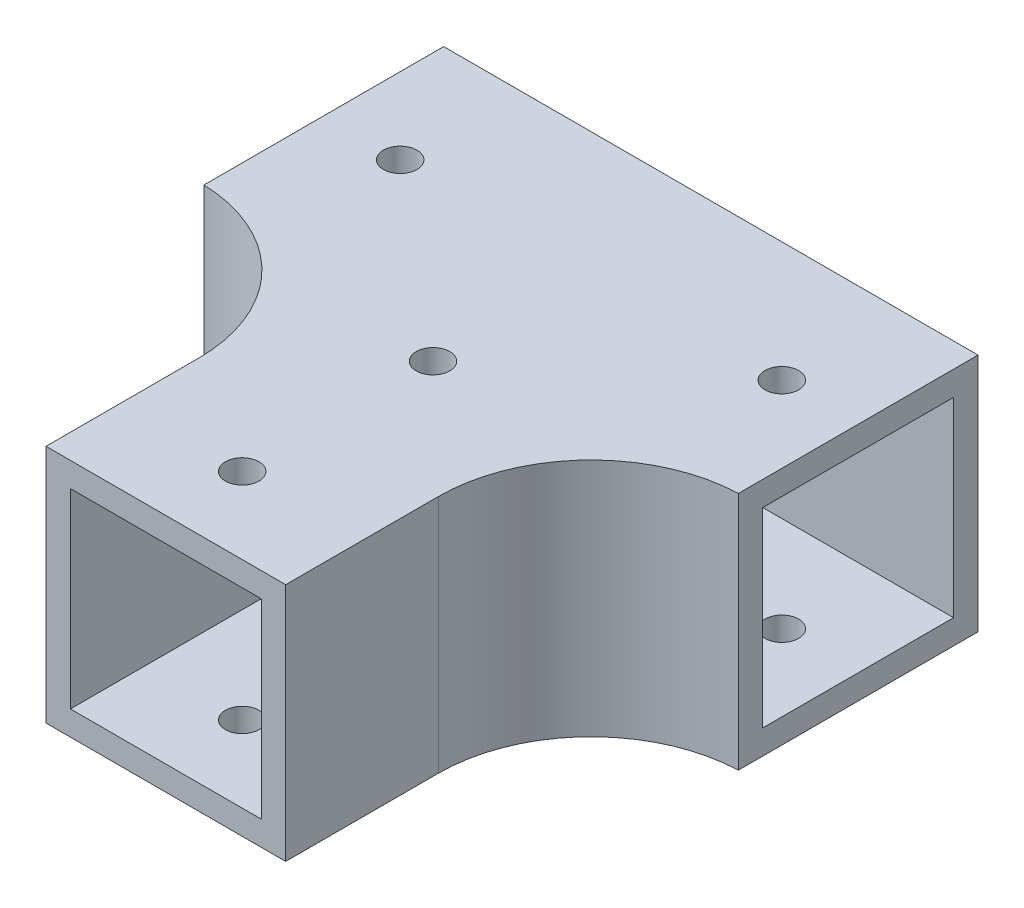
ISO-10303-21;
HEADER;
FILE_DESCRIPTION(('STEP AP214'),'2;1');
FILE_NAME('part.step','',(''),(''),'','','');
FILE_SCHEMA(('AUTOMOTIVE_DESIGN { 1 0 10303 214 1 1 1 1 }'));
ENDSEC;
DATA;
#1=APPLICATION_CONTEXT('core data for automotive mechanical design processes');
#2=APPLICATION_PROTOCOL_DEFINITION('international standard','automotive_design',2000,#1);
#3=PRODUCT_CONTEXT('',#1,'mechanical');
#4=PRODUCT('Part','Part','',(#3));
#5=PRODUCT_RELATED_PRODUCT_CATEGORY('part','',(#4));
#6=PRODUCT_DEFINITION_FORMATION('','',#4);
#7=PRODUCT_DEFINITION_CONTEXT('part definition',#1,'design');
#8=PRODUCT_DEFINITION('design','',#6,#7);
#9=PRODUCT_DEFINITION_SHAPE('','',#8);
#10=(LENGTH_UNIT() NAMED_UNIT(*) SI_UNIT(.MILLI.,.METRE.));
#11=(NAMED_UNIT(*) PLANE_ANGLE_UNIT() SI_UNIT($,.RADIAN.));
#12=(NAMED_UNIT(*) SI_UNIT($,.STERADIAN.) SOLID_ANGLE_UNIT());
#13=UNCERTAINTY_MEASURE_WITH_UNIT(LENGTH_MEASURE(1.E-05),#10,'distance_accuracy_value','');
#14=(GEOMETRIC_REPRESENTATION_CONTEXT(3) GLOBAL_UNCERTAINTY_ASSIGNED_CONTEXT((#13)) GLOBAL_UNIT_ASSIGNED_CONTEXT((#10,
#11,#12)) REPRESENTATION_CONTEXT('',''));
#15=CARTESIAN_POINT('',(0.,0.,0.));
#16=DIRECTION('',(0.,0.,1.));
#17=DIRECTION('',(1.,0.,0.));
#18=AXIS2_PLACEMENT_3D('',#15,#16,#17);
#19=CARTESIAN_POINT('',(70.,-12.5,12.5));
#20=DIRECTION('',(0.,0.,-1.));
#21=DIRECTION('',(-1.,0.,0.));
#22=AXIS2_PLACEMENT_3D('',#19,#20,#21);
#23=PLANE('',#22);
#24=DIRECTION('',(0.,1.,0.));
#25=VECTOR('',#24,1.);
#26=CARTESIAN_POINT('',(47.5,12.5,12.5));
#27=LINE('',#26,#25);
#28=CARTESIAN_POINT('',(47.5,-12.5,12.5));
#29=VERTEX_POINT('',#28);
#30=CARTESIAN_POINT('',(47.5,12.5,12.5));
#31=VERTEX_POINT('',#30);
#32=EDGE_CURVE('E198',#29,#31,#27,.T.);
#33=ORIENTED_EDGE('',*,*,#32,.T.);
#34=DIRECTION('',(-1.,0.,0.));
#35=VECTOR('',#34,1.);
#36=CARTESIAN_POINT('',(70.,12.5,12.5));
#37=LINE('',#36,#35);
#38=CARTESIAN_POINT('',(70.,12.5,12.5));
#39=VERTEX_POINT('',#38);
#40=EDGE_CURVE('E211',#39,#31,#37,.T.);
#41=ORIENTED_EDGE('',*,*,#40,.F.);
#42=DIRECTION('',(0.,-1.,0.));
#43=VECTOR('',#42,1.);
#44=CARTESIAN_POINT('',(70.,-12.5,12.5));
#45=LINE('',#44,#43);
#46=CARTESIAN_POINT('',(70.,-12.5,12.5));
#47=VERTEX_POINT('',#46);
#48=EDGE_CURVE('E327',#39,#47,#45,.T.);
#49=ORIENTED_EDGE('',*,*,#48,.T.);
#50=DIRECTION('',(-1.,0.,0.));
#51=VECTOR('',#50,1.);
#52=CARTESIAN_POINT('',(70.,-12.5,12.5));
#53=LINE('',#52,#51);
#54=EDGE_CURVE('E213',#47,#29,#53,.T.);
#55=ORIENTED_EDGE('',*,*,#54,.T.);
#56=EDGE_LOOP('',(#33,#41,#49,#55));
#57=FACE_BOUND('',#56,.T.);
#58=ADVANCED_FACE('F80',(#57),#23,.T.);
#59=CARTESIAN_POINT('',(70.,0.,0.));
#60=DIRECTION('',(1.,0.,0.));
#61=DIRECTION('',(0.,0.,-1.));
#62=AXIS2_PLACEMENT_3D('',#59,#60,#61);
#63=PLANE('',#62);
#64=DIRECTION('',(0.,1.,0.));
#65=VECTOR('',#64,1.);
#66=CARTESIAN_POINT('',(70.,0.,-15.7));
#67=LINE('',#66,#65);
#68=CARTESIAN_POINT('',(70.,-15.7,-15.7));
#69=VERTEX_POINT('',#68);
#70=CARTESIAN_POINT('',(70.,15.7,-15.7));
#71=VERTEX_POINT('',#70);
#72=EDGE_CURVE('E230',#69,#71,#67,.T.);
#73=ORIENTED_EDGE('',*,*,#72,.T.);
#74=DIRECTION('',(0.,0.,1.));
#75=VECTOR('',#74,1.);
#76=CARTESIAN_POINT('',(70.,15.7,0.));
#77=LINE('',#76,#75);
#78=CARTESIAN_POINT('',(70.,15.7,15.7));
#79=VERTEX_POINT('',#78);
#80=EDGE_CURVE('E233',#71,#79,#77,.T.);
#81=ORIENTED_EDGE('',*,*,#80,.T.);
#82=DIRECTION('',(0.,-1.,0.));
#83=VECTOR('',#82,1.);
#84=CARTESIAN_POINT('',(70.,0.,15.7));
#85=LINE('',#84,#83);
#86=CARTESIAN_POINT('',(70.,-15.7,15.7));
#87=VERTEX_POINT('',#86);
#88=EDGE_CURVE('E237',#79,#87,#85,.T.);
#89=ORIENTED_EDGE('',*,*,#88,.T.);
#90=DIRECTION('',(0.,0.,-1.));
#91=VECTOR('',#90,1.);
#92=CARTESIAN_POINT('',(70.,-15.7,0.));
#93=LINE('',#92,#91);
#94=EDGE_CURVE('E239',#87,#69,#93,.T.);
#95=ORIENTED_EDGE('',*,*,#94,.T.);
#96=EDGE_LOOP('',(#73,#81,#89,#95));
#97=FACE_BOUND('',#96,.T.);
#98=DIRECTION('',(0.,0.,1.));
#99=VECTOR('',#98,1.);
#100=CARTESIAN_POINT('',(70.,12.5,12.5));
#101=LINE('',#100,#99);
#102=CARTESIAN_POINT('',(70.,12.5,-12.5));
#103=VERTEX_POINT('',#102);
#104=EDGE_CURVE('E220',#103,#39,#101,.T.);
#105=ORIENTED_EDGE('',*,*,#104,.F.);
#106=DIRECTION('',(0.,1.,0.));
#107=VECTOR('',#106,1.);
#108=CARTESIAN_POINT('',(70.,-12.5,-12.5));
#109=LINE('',#108,#107);
#110=CARTESIAN_POINT('',(70.,-12.5,-12.5));
#111=VERTEX_POINT('',#110);
#112=EDGE_CURVE('E323',#111,#103,#109,.T.);
#113=ORIENTED_EDGE('',*,*,#112,.F.);
#114=DIRECTION('',(0.,0.,-1.));
#115=VECTOR('',#114,1.);
#116=CARTESIAN_POINT('',(70.,-12.5,12.5));
#117=LINE('',#116,#115);
#118=EDGE_CURVE('E329',#47,#111,#117,.T.);
#119=ORIENTED_EDGE('',*,*,#118,.F.);
#120=ORIENTED_EDGE('',*,*,#48,.F.);
#121=EDGE_LOOP('',(#105,#113,#119,#120));
#122=FACE_BOUND('',#121,.T.);
#123=ADVANCED_FACE('F360',(#97,#122),#63,.T.);
#124=CARTESIAN_POINT('',(0.,0.,0.));
#125=DIRECTION('',(1.,0.,0.));
#126=DIRECTION('',(0.,0.,-1.));
#127=AXIS2_PLACEMENT_3D('',#124,#125,#126);
#128=PLANE('',#127);
#129=DIRECTION('',(0.,1.,0.));
#130=VECTOR('',#129,1.);
#131=CARTESIAN_POINT('',(0.,0.,-15.7));
#132=LINE('',#131,#130);
#133=CARTESIAN_POINT('',(0.,-15.7,-15.7));
#134=VERTEX_POINT('',#133);
#135=CARTESIAN_POINT('',(0.,15.7,-15.7));
#136=VERTEX_POINT('',#135);
#137=EDGE_CURVE('E225',#134,#136,#132,.T.);
#138=ORIENTED_EDGE('',*,*,#137,.F.);
#139=DIRECTION('',(0.,0.,-1.));
#140=VECTOR('',#139,1.);
#141=CARTESIAN_POINT('',(0.,-15.7,0.));
#142=LINE('',#141,#140);
#143=CARTESIAN_POINT('',(0.,-15.7,15.7));
#144=VERTEX_POINT('',#143);
#145=EDGE_CURVE('E234',#144,#134,#142,.T.);
#146=ORIENTED_EDGE('',*,*,#145,.F.);
#147=DIRECTION('',(0.,-1.,0.));
#148=VECTOR('',#147,1.);
#149=CARTESIAN_POINT('',(0.,0.,15.7));
#150=LINE('',#149,#148);
#151=CARTESIAN_POINT('',(0.,15.7,15.7));
#152=VERTEX_POINT('',#151);
#153=EDGE_CURVE('E246',#152,#144,#150,.T.);
#154=ORIENTED_EDGE('',*,*,#153,.F.);
#155=DIRECTION('',(0.,0.,1.));
#156=VECTOR('',#155,1.);
#157=CARTESIAN_POINT('',(0.,15.7,0.));
#158=LINE('',#157,#156);
#159=EDGE_CURVE('E244',#136,#152,#158,.T.);
#160=ORIENTED_EDGE('',*,*,#159,.F.);
#161=EDGE_LOOP('',(#138,#146,#154,#160));
#162=FACE_BOUND('',#161,.T.);
#163=DIRECTION('',(0.,1.,0.));
#164=VECTOR('',#163,1.);
#165=CARTESIAN_POINT('',(0.,-12.5,-12.5));
#166=LINE('',#165,#164);
#167=CARTESIAN_POINT('',(0.,-12.5,-12.5));
#168=VERTEX_POINT('',#167);
#169=CARTESIAN_POINT('',(0.,12.5,-12.5));
#170=VERTEX_POINT('',#169);
#171=EDGE_CURVE('E322',#168,#170,#166,.T.);
#172=ORIENTED_EDGE('',*,*,#171,.T.);
#173=DIRECTION('',(0.,0.,1.));
#174=VECTOR('',#173,1.);
#175=CARTESIAN_POINT('',(0.,12.5,12.5));
#176=LINE('',#175,#174);
#177=CARTESIAN_POINT('',(0.,12.5,12.5));
#178=VERTEX_POINT('',#177);
#179=EDGE_CURVE('E334',#170,#178,#176,.T.);
#180=ORIENTED_EDGE('',*,*,#179,.T.);
#181=DIRECTION('',(0.,-1.,0.));
#182=VECTOR('',#181,1.);
#183=CARTESIAN_POINT('',(0.,-12.5,12.5));
#184=LINE('',#183,#182);
#185=CARTESIAN_POINT('',(0.,-12.5,12.5));
#186=VERTEX_POINT('',#185);
#187=EDGE_CURVE('E337',#178,#186,#184,.T.);
#188=ORIENTED_EDGE('',*,*,#187,.T.);
#189=DIRECTION('',(0.,0.,-1.));
#190=VECTOR('',#189,1.);
#191=CARTESIAN_POINT('',(0.,-12.5,12.5));
#192=LINE('',#191,#190);
#193=EDGE_CURVE('E325',#186,#168,#192,.T.);
#194=ORIENTED_EDGE('',*,*,#193,.T.);
#195=EDGE_LOOP('',(#172,#180,#188,#194));
#196=FACE_BOUND('',#195,.T.);
#197=ADVANCED_FACE('F354',(#162,#196),#128,.F.);
#198=CARTESIAN_POINT('',(70.,0.,-15.7));
#199=DIRECTION('',(0.,0.,1.));
#200=DIRECTION('',(1.,0.,0.));
#201=AXIS2_PLACEMENT_3D('',#198,#199,#200);
#202=PLANE('',#201);
#203=ORIENTED_EDGE('',*,*,#137,.T.);
#204=DIRECTION('',(-1.,0.,0.));
#205=VECTOR('',#204,1.);
#206=CARTESIAN_POINT('',(70.,15.7,-15.7));
#207=LINE('',#206,#205);
#208=EDGE_CURVE('E251',#71,#136,#207,.T.);
#209=ORIENTED_EDGE('',*,*,#208,.F.);
#210=ORIENTED_EDGE('',*,*,#72,.F.);
#211=DIRECTION('',(-1.,0.,0.));
#212=VECTOR('',#211,1.);
#213=CARTESIAN_POINT('',(70.,-15.7,-15.7));
#214=LINE('',#213,#212);
#215=EDGE_CURVE('E241',#69,#134,#214,.T.);
#216=ORIENTED_EDGE('',*,*,#215,.T.);
#217=EDGE_LOOP('',(#203,#209,#210,#216));
#218=FACE_BOUND('',#217,.T.);
#219=ADVANCED_FACE('F405',(#218),#202,.F.);
#220=CARTESIAN_POINT('',(70.,15.7,0.));
#221=DIRECTION('',(0.,-1.,0.));
#222=DIRECTION('',(0.,0.,-1.));
#223=AXIS2_PLACEMENT_3D('',#220,#221,#222);
#224=PLANE('',#223);
#225=CARTESIAN_POINT('',(10.,15.7,0.));
#226=DIRECTION('',(0.,1.,0.));
#227=DIRECTION('',(0.,0.,1.));
#228=AXIS2_PLACEMENT_3D('',#225,#226,#227);
#229=CIRCLE('',#228,2.2);
#230=CARTESIAN_POINT('',(10.,15.7,2.2));
#231=VERTEX_POINT('',#230);
#232=EDGE_CURVE('E472',#231,#231,#229,.T.);
#233=ORIENTED_EDGE('',*,*,#232,.F.);
#234=EDGE_LOOP('',(#233));
#235=FACE_BOUND('',#234,.T.);
#236=CARTESIAN_POINT('',(35.,15.7,20.7));
#237=DIRECTION('',(0.,1.,0.));
#238=DIRECTION('',(0.,0.,1.));
#239=AXIS2_PLACEMENT_3D('',#236,#237,#238);
#240=CIRCLE('',#239,2.2);
#241=CARTESIAN_POINT('',(35.,15.7,22.9));
#242=VERTEX_POINT('',#241);
#243=EDGE_CURVE('E483',#242,#242,#240,.T.);
#244=ORIENTED_EDGE('',*,*,#243,.F.);
#245=EDGE_LOOP('',(#244));
#246=FACE_BOUND('',#245,.T.);
#247=CARTESIAN_POINT('',(35.,15.7,45.7));
#248=DIRECTION('',(0.,1.,0.));
#249=DIRECTION('',(0.,0.,1.));
#250=AXIS2_PLACEMENT_3D('',#247,#248,#249);
#251=CIRCLE('',#250,2.2);
#252=CARTESIAN_POINT('',(35.,15.7,47.9));
#253=VERTEX_POINT('',#252);
#254=EDGE_CURVE('E475',#253,#253,#251,.T.);
#255=ORIENTED_EDGE('',*,*,#254,.F.);
#256=EDGE_LOOP('',(#255));
#257=FACE_BOUND('',#256,.T.);
#258=CARTESIAN_POINT('',(60.,15.7,0.));
#259=DIRECTION('',(0.,1.,0.));
#260=DIRECTION('',(0.,0.,1.));
#261=AXIS2_PLACEMENT_3D('',#258,#259,#260);
#262=CIRCLE('',#261,2.2);
#263=CARTESIAN_POINT('',(60.,15.7,2.2));
#264=VERTEX_POINT('',#263);
#265=EDGE_CURVE('E466',#264,#264,#262,.T.);
#266=ORIENTED_EDGE('',*,*,#265,.F.);
#267=EDGE_LOOP('',(#266));
#268=FACE_BOUND('',#267,.T.);
#269=ORIENTED_EDGE('',*,*,#159,.T.);
#270=CARTESIAN_POINT('',(-0.700000000000008,15.7,35.6877462461379));
#271=DIRECTION('',(0.,-1.,0.));
#272=DIRECTION('',(0.,0.,-1.));
#273=AXIS2_PLACEMENT_3D('',#270,#271,#272);
#274=CIRCLE('',#273,20.);
#275=CARTESIAN_POINT('',(19.3,15.7,35.6877462461379));
#276=VERTEX_POINT('',#275);
#277=EDGE_CURVE('E12',#152,#276,#274,.T.);
#278=ORIENTED_EDGE('',*,*,#277,.T.);
#279=DIRECTION('',(0.,0.,-1.));
#280=VECTOR('',#279,1.);
#281=CARTESIAN_POINT('',(19.3,15.7,55.7));
#282=LINE('',#281,#280);
#283=CARTESIAN_POINT('',(19.3,15.7,55.7));
#284=VERTEX_POINT('',#283);
#285=EDGE_CURVE('E317',#284,#276,#282,.T.);
#286=ORIENTED_EDGE('',*,*,#285,.F.);
#287=DIRECTION('',(-1.,0.,0.));
#288=VECTOR('',#287,1.);
#289=CARTESIAN_POINT('',(22.5,15.7,55.7));
#290=LINE('',#289,#288);
#291=CARTESIAN_POINT('',(50.7,15.7,55.7));
#292=VERTEX_POINT('',#291);
#293=EDGE_CURVE('E305',#292,#284,#290,.T.);
#294=ORIENTED_EDGE('',*,*,#293,.F.);
#295=DIRECTION('',(0.,0.,-1.));
#296=VECTOR('',#295,1.);
#297=CARTESIAN_POINT('',(50.7,15.7,55.7));
#298=LINE('',#297,#296);
#299=CARTESIAN_POINT('',(50.7,15.7,35.6877462461379));
#300=VERTEX_POINT('',#299);
#301=EDGE_CURVE('E319',#292,#300,#298,.T.);
#302=ORIENTED_EDGE('',*,*,#301,.T.);
#303=CARTESIAN_POINT('',(70.7,15.7,35.6877462461379));
#304=DIRECTION('',(0.,-1.,0.));
#305=DIRECTION('',(0.,0.,-1.));
#306=AXIS2_PLACEMENT_3D('',#303,#304,#305);
#307=CIRCLE('',#306,20.);
#308=EDGE_CURVE('E259',#300,#79,#307,.T.);
#309=ORIENTED_EDGE('',*,*,#308,.T.);
#310=ORIENTED_EDGE('',*,*,#80,.F.);
#311=ORIENTED_EDGE('',*,*,#208,.T.);
#312=EDGE_LOOP('',(#269,#278,#286,#294,#302,#309,#310,#311));
#313=FACE_BOUND('',#312,.T.);
#314=ADVANCED_FACE('F409',(#235,#246,#257,#268,#313),#224,.F.);
#315=CARTESIAN_POINT('',(70.,-15.7,0.));
#316=DIRECTION('',(0.,1.,0.));
#317=DIRECTION('',(0.,0.,1.));
#318=AXIS2_PLACEMENT_3D('',#315,#316,#317);
#319=PLANE('',#318);
#320=CARTESIAN_POINT('',(10.,-15.7,0.));
#321=DIRECTION('',(0.,1.,0.));
#322=DIRECTION('',(0.,0.,1.));
#323=AXIS2_PLACEMENT_3D('',#320,#321,#322);
#324=CIRCLE('',#323,2.2);
#325=CARTESIAN_POINT('',(10.,-15.7,2.2));
#326=VERTEX_POINT('',#325);
#327=EDGE_CURVE('E268',#326,#326,#324,.T.);
#328=ORIENTED_EDGE('',*,*,#327,.T.);
#329=EDGE_LOOP('',(#328));
#330=FACE_BOUND('',#329,.T.);
#331=CARTESIAN_POINT('',(35.,-15.7,20.7));
#332=DIRECTION('',(0.,1.,0.));
#333=DIRECTION('',(0.,0.,1.));
#334=AXIS2_PLACEMENT_3D('',#331,#332,#333);
#335=CIRCLE('',#334,2.2);
#336=CARTESIAN_POINT('',(35.,-15.7,22.9));
#337=VERTEX_POINT('',#336);
#338=EDGE_CURVE('E479',#337,#337,#335,.T.);
#339=ORIENTED_EDGE('',*,*,#338,.T.);
#340=EDGE_LOOP('',(#339));
#341=FACE_BOUND('',#340,.T.);
#342=CARTESIAN_POINT('',(35.,-15.7,45.7));
#343=DIRECTION('',(0.,1.,0.));
#344=DIRECTION('',(0.,0.,1.));
#345=AXIS2_PLACEMENT_3D('',#342,#343,#344);
#346=CIRCLE('',#345,2.2);
#347=CARTESIAN_POINT('',(35.,-15.7,47.9));
#348=VERTEX_POINT('',#347);
#349=EDGE_CURVE('E469',#348,#348,#346,.T.);
#350=ORIENTED_EDGE('',*,*,#349,.T.);
#351=EDGE_LOOP('',(#350));
#352=FACE_BOUND('',#351,.T.);
#353=CARTESIAN_POINT('',(60.,-15.7,0.));
#354=DIRECTION('',(0.,1.,0.));
#355=DIRECTION('',(0.,0.,1.));
#356=AXIS2_PLACEMENT_3D('',#353,#354,#355);
#357=CIRCLE('',#356,2.2);
#358=CARTESIAN_POINT('',(60.,-15.7,2.2));
#359=VERTEX_POINT('',#358);
#360=EDGE_CURVE('E468',#359,#359,#357,.T.);
#361=ORIENTED_EDGE('',*,*,#360,.T.);
#362=EDGE_LOOP('',(#361));
#363=FACE_BOUND('',#362,.T.);
#364=ORIENTED_EDGE('',*,*,#145,.T.);
#365=ORIENTED_EDGE('',*,*,#215,.F.);
#366=ORIENTED_EDGE('',*,*,#94,.F.);
#367=CARTESIAN_POINT('',(70.7,-15.7,35.6877462461379));
#368=DIRECTION('',(0.,1.,0.));
#369=DIRECTION('',(0.,0.,1.));
#370=AXIS2_PLACEMENT_3D('',#367,#368,#369);
#371=CIRCLE('',#370,20.);
#372=CARTESIAN_POINT('',(50.7,-15.7,35.6877462461379));
#373=VERTEX_POINT('',#372);
#374=EDGE_CURVE('E261',#87,#373,#371,.T.);
#375=ORIENTED_EDGE('',*,*,#374,.T.);
#376=DIRECTION('',(0.,0.,-1.));
#377=VECTOR('',#376,1.);
#378=CARTESIAN_POINT('',(50.7,-15.7,55.7));
#379=LINE('',#378,#377);
#380=CARTESIAN_POINT('',(50.7,-15.7,55.7));
#381=VERTEX_POINT('',#380);
#382=EDGE_CURVE('E311',#381,#373,#379,.T.);
#383=ORIENTED_EDGE('',*,*,#382,.F.);
#384=DIRECTION('',(1.,0.,0.));
#385=VECTOR('',#384,1.);
#386=CARTESIAN_POINT('',(22.5,-15.7,55.7));
#387=LINE('',#386,#385);
#388=CARTESIAN_POINT('',(19.3,-15.7,55.7));
#389=VERTEX_POINT('',#388);
#390=EDGE_CURVE('E309',#389,#381,#387,.T.);
#391=ORIENTED_EDGE('',*,*,#390,.F.);
#392=DIRECTION('',(0.,0.,-1.));
#393=VECTOR('',#392,1.);
#394=CARTESIAN_POINT('',(19.3,-15.7,55.7));
#395=LINE('',#394,#393);
#396=CARTESIAN_POINT('',(19.3,-15.7,35.6877462461379));
#397=VERTEX_POINT('',#396);
#398=EDGE_CURVE('E314',#389,#397,#395,.T.);
#399=ORIENTED_EDGE('',*,*,#398,.T.);
#400=CARTESIAN_POINT('',(-0.700000000000008,-15.7,35.6877462461379));
#401=DIRECTION('',(0.,1.,0.));
#402=DIRECTION('',(0.,0.,1.));
#403=AXIS2_PLACEMENT_3D('',#400,#401,#402);
#404=CIRCLE('',#403,20.);
#405=EDGE_CURVE('E89',#397,#144,#404,.T.);
#406=ORIENTED_EDGE('',*,*,#405,.T.);
#407=EDGE_LOOP('',(#364,#365,#366,#375,#383,#391,#399,#406));
#408=FACE_BOUND('',#407,.T.);
#409=ADVANCED_FACE('F398',(#330,#341,#352,#363,#408),#319,.F.);
#410=CARTESIAN_POINT('',(70.,-12.5,-12.5));
#411=DIRECTION('',(0.,0.,1.));
#412=DIRECTION('',(1.,0.,0.));
#413=AXIS2_PLACEMENT_3D('',#410,#411,#412);
#414=PLANE('',#413);
#415=ORIENTED_EDGE('',*,*,#171,.F.);
#416=DIRECTION('',(-1.,0.,0.));
#417=VECTOR('',#416,1.);
#418=CARTESIAN_POINT('',(70.,-12.5,-12.5));
#419=LINE('',#418,#417);
#420=EDGE_CURVE('E331',#111,#168,#419,.T.);
#421=ORIENTED_EDGE('',*,*,#420,.F.);
#422=ORIENTED_EDGE('',*,*,#112,.T.);
#423=DIRECTION('',(-1.,0.,0.));
#424=VECTOR('',#423,1.);
#425=CARTESIAN_POINT('',(70.,12.5,-12.5));
#426=LINE('',#425,#424);
#427=EDGE_CURVE('E221',#103,#170,#426,.T.);
#428=ORIENTED_EDGE('',*,*,#427,.T.);
#429=EDGE_LOOP('',(#415,#421,#422,#428));
#430=FACE_BOUND('',#429,.T.);
#431=ADVANCED_FACE('F356',(#430),#414,.T.);
#432=CARTESIAN_POINT('',(70.,12.5,12.5));
#433=DIRECTION('',(0.,-1.,0.));
#434=DIRECTION('',(0.,0.,-1.));
#435=AXIS2_PLACEMENT_3D('',#432,#433,#434);
#436=PLANE('',#435);
#437=CARTESIAN_POINT('',(10.,12.5,0.));
#438=DIRECTION('',(0.,-1.,0.));
#439=DIRECTION('',(0.,0.,-1.));
#440=AXIS2_PLACEMENT_3D('',#437,#438,#439);
#441=CIRCLE('',#440,2.2);
#442=CARTESIAN_POINT('',(10.,12.5,-2.2));
#443=VERTEX_POINT('',#442);
#444=EDGE_CURVE('E215',#443,#443,#441,.T.);
#445=ORIENTED_EDGE('',*,*,#444,.F.);
#446=EDGE_LOOP('',(#445));
#447=FACE_BOUND('',#446,.T.);
#448=CARTESIAN_POINT('',(35.,12.5,20.7));
#449=DIRECTION('',(0.,-1.,0.));
#450=DIRECTION('',(0.,0.,-1.));
#451=AXIS2_PLACEMENT_3D('',#448,#449,#450);
#452=CIRCLE('',#451,2.2);
#453=CARTESIAN_POINT('',(35.,12.5,18.5));
#454=VERTEX_POINT('',#453);
#455=EDGE_CURVE('E274',#454,#454,#452,.T.);
#456=ORIENTED_EDGE('',*,*,#455,.F.);
#457=EDGE_LOOP('',(#456));
#458=FACE_BOUND('',#457,.T.);
#459=CARTESIAN_POINT('',(35.,12.5,45.7));
#460=DIRECTION('',(0.,-1.,0.));
#461=DIRECTION('',(0.,0.,-1.));
#462=AXIS2_PLACEMENT_3D('',#459,#460,#461);
#463=CIRCLE('',#462,2.2);
#464=CARTESIAN_POINT('',(35.,12.5,43.5));
#465=VERTEX_POINT('',#464);
#466=EDGE_CURVE('E271',#465,#465,#463,.T.);
#467=ORIENTED_EDGE('',*,*,#466,.F.);
#468=EDGE_LOOP('',(#467));
#469=FACE_BOUND('',#468,.T.);
#470=CARTESIAN_POINT('',(60.,12.5,0.));
#471=DIRECTION('',(0.,-1.,0.));
#472=DIRECTION('',(0.,0.,-1.));
#473=AXIS2_PLACEMENT_3D('',#470,#471,#472);
#474=CIRCLE('',#473,2.2);
#475=CARTESIAN_POINT('',(60.,12.5,-2.2));
#476=VERTEX_POINT('',#475);
#477=EDGE_CURVE('E267',#476,#476,#474,.T.);
#478=ORIENTED_EDGE('',*,*,#477,.F.);
#479=EDGE_LOOP('',(#478));
#480=FACE_BOUND('',#479,.T.);
#481=ORIENTED_EDGE('',*,*,#179,.F.);
#482=ORIENTED_EDGE('',*,*,#427,.F.);
#483=ORIENTED_EDGE('',*,*,#104,.T.);
#484=ORIENTED_EDGE('',*,*,#40,.T.);
#485=DIRECTION('',(0.,0.,-1.));
#486=VECTOR('',#485,1.);
#487=CARTESIAN_POINT('',(47.5,12.5,55.7));
#488=LINE('',#487,#486);
#489=CARTESIAN_POINT('',(47.5,12.5,55.7));
#490=VERTEX_POINT('',#489);
#491=EDGE_CURVE('E194',#490,#31,#488,.T.);
#492=ORIENTED_EDGE('',*,*,#491,.F.);
#493=DIRECTION('',(-1.,0.,0.));
#494=VECTOR('',#493,1.);
#495=CARTESIAN_POINT('',(22.5,12.5,55.7));
#496=LINE('',#495,#494);
#497=CARTESIAN_POINT('',(22.5,12.5,55.7));
#498=VERTEX_POINT('',#497);
#499=EDGE_CURVE('E291',#490,#498,#496,.T.);
#500=ORIENTED_EDGE('',*,*,#499,.T.);
#501=DIRECTION('',(0.,0.,-1.));
#502=VECTOR('',#501,1.);
#503=CARTESIAN_POINT('',(22.5,12.5,55.7));
#504=LINE('',#503,#502);
#505=CARTESIAN_POINT('',(22.5,12.5,12.5));
#506=VERTEX_POINT('',#505);
#507=EDGE_CURVE('E206',#498,#506,#504,.T.);
#508=ORIENTED_EDGE('',*,*,#507,.T.);
#509=EDGE_CURVE('E222',#506,#178,#37,.T.);
#510=ORIENTED_EDGE('',*,*,#509,.T.);
#511=EDGE_LOOP('',(#481,#482,#483,#484,#492,#500,#508,#510));
#512=FACE_BOUND('',#511,.T.);
#513=ADVANCED_FACE('F217',(#447,#458,#469,#480,#512),#436,.T.);
#514=DIRECTION('',(0.,-1.,0.));
#515=VECTOR('',#514,1.);
#516=CARTESIAN_POINT('',(22.5,12.5,12.5));
#517=LINE('',#516,#515);
#518=CARTESIAN_POINT('',(22.5,-12.5,12.5));
#519=VERTEX_POINT('',#518);
#520=EDGE_CURVE('E214',#506,#519,#517,.T.);
#521=ORIENTED_EDGE('',*,*,#520,.T.);
#522=EDGE_CURVE('E342',#519,#186,#53,.T.);
#523=ORIENTED_EDGE('',*,*,#522,.T.);
#524=ORIENTED_EDGE('',*,*,#187,.F.);
#525=ORIENTED_EDGE('',*,*,#509,.F.);
#526=EDGE_LOOP('',(#521,#523,#524,#525));
#527=FACE_BOUND('',#526,.T.);
#528=ADVANCED_FACE('F349',(#527),#23,.T.);
#529=CARTESIAN_POINT('',(70.,-12.5,12.5));
#530=DIRECTION('',(0.,1.,0.));
#531=DIRECTION('',(0.,0.,1.));
#532=AXIS2_PLACEMENT_3D('',#529,#530,#531);
#533=PLANE('',#532);
#534=CARTESIAN_POINT('',(10.,-12.5,0.));
#535=DIRECTION('',(0.,1.,0.));
#536=DIRECTION('',(0.,0.,1.));
#537=AXIS2_PLACEMENT_3D('',#534,#535,#536);
#538=CIRCLE('',#537,2.2);
#539=CARTESIAN_POINT('',(10.,-12.5,2.2));
#540=VERTEX_POINT('',#539);
#541=EDGE_CURVE('E84',#540,#540,#538,.T.);
#542=ORIENTED_EDGE('',*,*,#541,.F.);
#543=EDGE_LOOP('',(#542));
#544=FACE_BOUND('',#543,.T.);
#545=CARTESIAN_POINT('',(35.,-12.5,20.7));
#546=DIRECTION('',(0.,1.,0.));
#547=DIRECTION('',(0.,0.,1.));
#548=AXIS2_PLACEMENT_3D('',#545,#546,#547);
#549=CIRCLE('',#548,2.2);
#550=CARTESIAN_POINT('',(35.,-12.5,22.9));
#551=VERTEX_POINT('',#550);
#552=EDGE_CURVE('E272',#551,#551,#549,.T.);
#553=ORIENTED_EDGE('',*,*,#552,.F.);
#554=EDGE_LOOP('',(#553));
#555=FACE_BOUND('',#554,.T.);
#556=CARTESIAN_POINT('',(35.,-12.5,45.7));
#557=DIRECTION('',(0.,1.,0.));
#558=DIRECTION('',(0.,0.,1.));
#559=AXIS2_PLACEMENT_3D('',#556,#557,#558);
#560=CIRCLE('',#559,2.2);
#561=CARTESIAN_POINT('',(35.,-12.5,47.9));
#562=VERTEX_POINT('',#561);
#563=EDGE_CURVE('E269',#562,#562,#560,.T.);
#564=ORIENTED_EDGE('',*,*,#563,.F.);
#565=EDGE_LOOP('',(#564));
#566=FACE_BOUND('',#565,.T.);
#567=CARTESIAN_POINT('',(60.,-12.5,0.));
#568=DIRECTION('',(0.,1.,0.));
#569=DIRECTION('',(0.,0.,1.));
#570=AXIS2_PLACEMENT_3D('',#567,#568,#569);
#571=CIRCLE('',#570,2.2);
#572=CARTESIAN_POINT('',(60.,-12.5,2.2));
#573=VERTEX_POINT('',#572);
#574=EDGE_CURVE('E264',#573,#573,#571,.T.);
#575=ORIENTED_EDGE('',*,*,#574,.F.);
#576=EDGE_LOOP('',(#575));
#577=FACE_BOUND('',#576,.T.);
#578=ORIENTED_EDGE('',*,*,#193,.F.);
#579=ORIENTED_EDGE('',*,*,#522,.F.);
#580=DIRECTION('',(0.,0.,-1.));
#581=VECTOR('',#580,1.);
#582=CARTESIAN_POINT('',(22.5,-12.5,55.7));
#583=LINE('',#582,#581);
#584=CARTESIAN_POINT('',(22.5,-12.5,55.7));
#585=VERTEX_POINT('',#584);
#586=EDGE_CURVE('E300',#585,#519,#583,.T.);
#587=ORIENTED_EDGE('',*,*,#586,.F.);
#588=DIRECTION('',(1.,0.,0.));
#589=VECTOR('',#588,1.);
#590=CARTESIAN_POINT('',(22.5,-12.5,55.7));
#591=LINE('',#590,#589);
#592=CARTESIAN_POINT('',(47.5,-12.5,55.7));
#593=VERTEX_POINT('',#592);
#594=EDGE_CURVE('E296',#585,#593,#591,.T.);
#595=ORIENTED_EDGE('',*,*,#594,.T.);
#596=DIRECTION('',(0.,0.,-1.));
#597=VECTOR('',#596,1.);
#598=CARTESIAN_POINT('',(47.5,-12.5,55.7));
#599=LINE('',#598,#597);
#600=EDGE_CURVE('E298',#593,#29,#599,.T.);
#601=ORIENTED_EDGE('',*,*,#600,.T.);
#602=ORIENTED_EDGE('',*,*,#54,.F.);
#603=ORIENTED_EDGE('',*,*,#118,.T.);
#604=ORIENTED_EDGE('',*,*,#420,.T.);
#605=EDGE_LOOP('',(#578,#579,#587,#595,#601,#602,#603,#604));
#606=FACE_BOUND('',#605,.T.);
#607=ADVANCED_FACE('F352',(#544,#555,#566,#577,#606),#533,.T.);
#608=CARTESIAN_POINT('',(0.,0.,55.7));
#609=DIRECTION('',(0.,0.,1.));
#610=DIRECTION('',(1.,0.,0.));
#611=AXIS2_PLACEMENT_3D('',#608,#609,#610);
#612=PLANE('',#611);
#613=DIRECTION('',(0.,1.,0.));
#614=VECTOR('',#613,1.);
#615=CARTESIAN_POINT('',(50.7,12.5,55.7));
#616=LINE('',#615,#614);
#617=EDGE_CURVE('E205',#381,#292,#616,.T.);
#618=ORIENTED_EDGE('',*,*,#617,.T.);
#619=ORIENTED_EDGE('',*,*,#293,.T.);
#620=DIRECTION('',(0.,-1.,0.));
#621=VECTOR('',#620,1.);
#622=CARTESIAN_POINT('',(19.3,12.5,55.7));
#623=LINE('',#622,#621);
#624=EDGE_CURVE('E307',#284,#389,#623,.T.);
#625=ORIENTED_EDGE('',*,*,#624,.T.);
#626=ORIENTED_EDGE('',*,*,#390,.T.);
#627=EDGE_LOOP('',(#618,#619,#625,#626));
#628=FACE_BOUND('',#627,.T.);
#629=ORIENTED_EDGE('',*,*,#499,.F.);
#630=DIRECTION('',(0.,1.,0.));
#631=VECTOR('',#630,1.);
#632=CARTESIAN_POINT('',(47.5,12.5,55.7));
#633=LINE('',#632,#631);
#634=EDGE_CURVE('E201',#593,#490,#633,.T.);
#635=ORIENTED_EDGE('',*,*,#634,.F.);
#636=ORIENTED_EDGE('',*,*,#594,.F.);
#637=DIRECTION('',(0.,-1.,0.));
#638=VECTOR('',#637,1.);
#639=CARTESIAN_POINT('',(22.5,12.5,55.7));
#640=LINE('',#639,#638);
#641=EDGE_CURVE('E293',#498,#585,#640,.T.);
#642=ORIENTED_EDGE('',*,*,#641,.F.);
#643=EDGE_LOOP('',(#629,#635,#636,#642));
#644=FACE_BOUND('',#643,.T.);
#645=ADVANCED_FACE('F363',(#628,#644),#612,.T.);
#646=CARTESIAN_POINT('',(50.7,12.5,55.7));
#647=DIRECTION('',(-1.,0.,0.));
#648=DIRECTION('',(0.,0.,1.));
#649=AXIS2_PLACEMENT_3D('',#646,#647,#648);
#650=PLANE('',#649);
#651=ORIENTED_EDGE('',*,*,#382,.T.);
#652=DIRECTION('',(0.,-1.,0.));
#653=VECTOR('',#652,1.);
#654=CARTESIAN_POINT('',(50.7,12.5,35.6877462461379));
#655=LINE('',#654,#653);
#656=EDGE_CURVE('E254',#373,#300,#655,.F.);
#657=ORIENTED_EDGE('',*,*,#656,.T.);
#658=ORIENTED_EDGE('',*,*,#301,.F.);
#659=ORIENTED_EDGE('',*,*,#617,.F.);
#660=EDGE_LOOP('',(#651,#657,#658,#659));
#661=FACE_BOUND('',#660,.T.);
#662=ADVANCED_FACE('F638',(#661),#650,.F.);
#663=CARTESIAN_POINT('',(19.3,12.5,55.7));
#664=DIRECTION('',(1.,0.,0.));
#665=DIRECTION('',(0.,1.,0.));
#666=AXIS2_PLACEMENT_3D('',#663,#664,#665);
#667=PLANE('',#666);
#668=ORIENTED_EDGE('',*,*,#285,.T.);
#669=DIRECTION('',(0.,-1.,0.));
#670=VECTOR('',#669,1.);
#671=CARTESIAN_POINT('',(19.3,12.5,35.6877462461379));
#672=LINE('',#671,#670);
#673=EDGE_CURVE('E257',#276,#397,#672,.T.);
#674=ORIENTED_EDGE('',*,*,#673,.T.);
#675=ORIENTED_EDGE('',*,*,#398,.F.);
#676=ORIENTED_EDGE('',*,*,#624,.F.);
#677=EDGE_LOOP('',(#668,#674,#675,#676));
#678=FACE_BOUND('',#677,.T.);
#679=ADVANCED_FACE('F376',(#678),#667,.F.);
#680=CARTESIAN_POINT('',(47.5,12.5,55.7));
#681=DIRECTION('',(-1.,0.,0.));
#682=DIRECTION('',(0.,0.,1.));
#683=AXIS2_PLACEMENT_3D('',#680,#681,#682);
#684=PLANE('',#683);
#685=ORIENTED_EDGE('',*,*,#491,.T.);
#686=ORIENTED_EDGE('',*,*,#32,.F.);
#687=ORIENTED_EDGE('',*,*,#600,.F.);
#688=ORIENTED_EDGE('',*,*,#634,.T.);
#689=EDGE_LOOP('',(#685,#686,#687,#688));
#690=FACE_BOUND('',#689,.T.);
#691=ADVANCED_FACE('F196',(#690),#684,.T.);
#692=CARTESIAN_POINT('',(22.5,12.5,55.7));
#693=DIRECTION('',(1.,0.,0.));
#694=DIRECTION('',(0.,1.,0.));
#695=AXIS2_PLACEMENT_3D('',#692,#693,#694);
#696=PLANE('',#695);
#697=ORIENTED_EDGE('',*,*,#586,.T.);
#698=ORIENTED_EDGE('',*,*,#520,.F.);
#699=ORIENTED_EDGE('',*,*,#507,.F.);
#700=ORIENTED_EDGE('',*,*,#641,.T.);
#701=EDGE_LOOP('',(#697,#698,#699,#700));
#702=FACE_BOUND('',#701,.T.);
#703=ADVANCED_FACE('F367',(#702),#696,.T.);
#704=CARTESIAN_POINT('',(70.7,0.,35.6877462461379));
#705=DIRECTION('',(0.,-1.,0.));
#706=DIRECTION('',(0.,0.,-1.));
#707=AXIS2_PLACEMENT_3D('',#704,#705,#706);
#708=CYLINDRICAL_SURFACE('',#707,20.);
#709=ORIENTED_EDGE('',*,*,#374,.F.);
#710=ORIENTED_EDGE('',*,*,#88,.F.);
#711=ORIENTED_EDGE('',*,*,#308,.F.);
#712=ORIENTED_EDGE('',*,*,#656,.F.);
#713=EDGE_LOOP('',(#709,#710,#711,#712));
#714=FACE_BOUND('',#713,.T.);
#715=ADVANCED_FACE('F369',(#714),#708,.F.);
#716=CARTESIAN_POINT('',(-0.700000000000008,0.,35.6877462461379));
#717=DIRECTION('',(0.,-1.,0.));
#718=DIRECTION('',(0.,0.,-1.));
#719=AXIS2_PLACEMENT_3D('',#716,#717,#718);
#720=CYLINDRICAL_SURFACE('',#719,20.);
#721=ORIENTED_EDGE('',*,*,#277,.F.);
#722=ORIENTED_EDGE('',*,*,#153,.T.);
#723=ORIENTED_EDGE('',*,*,#405,.F.);
#724=ORIENTED_EDGE('',*,*,#673,.F.);
#725=EDGE_LOOP('',(#721,#722,#723,#724));
#726=FACE_BOUND('',#725,.T.);
#727=ADVANCED_FACE('F82',(#726),#720,.F.);
#728=CARTESIAN_POINT('',(60.,-15.7,0.));
#729=DIRECTION('',(0.,1.,0.));
#730=DIRECTION('',(0.,0.,1.));
#731=AXIS2_PLACEMENT_3D('',#728,#729,#730);
#732=CYLINDRICAL_SURFACE('',#731,2.2);
#733=ORIENTED_EDGE('',*,*,#574,.T.);
#734=EDGE_LOOP('',(#733));
#735=FACE_BOUND('',#734,.T.);
#736=ORIENTED_EDGE('',*,*,#360,.F.);
#737=EDGE_LOOP('',(#736));
#738=FACE_BOUND('',#737,.T.);
#739=ADVANCED_FACE('F434',(#735,#738),#732,.F.);
#740=CARTESIAN_POINT('',(35.,-15.7,45.7));
#741=DIRECTION('',(0.,1.,0.));
#742=DIRECTION('',(0.,0.,1.));
#743=AXIS2_PLACEMENT_3D('',#740,#741,#742);
#744=CYLINDRICAL_SURFACE('',#743,2.2);
#745=ORIENTED_EDGE('',*,*,#563,.T.);
#746=EDGE_LOOP('',(#745));
#747=FACE_BOUND('',#746,.T.);
#748=ORIENTED_EDGE('',*,*,#349,.F.);
#749=EDGE_LOOP('',(#748));
#750=FACE_BOUND('',#749,.T.);
#751=ADVANCED_FACE('F438',(#747,#750),#744,.F.);
#752=CARTESIAN_POINT('',(35.,-15.7,20.7));
#753=DIRECTION('',(0.,1.,0.));
#754=DIRECTION('',(0.,0.,1.));
#755=AXIS2_PLACEMENT_3D('',#752,#753,#754);
#756=CYLINDRICAL_SURFACE('',#755,2.2);
#757=ORIENTED_EDGE('',*,*,#552,.T.);
#758=EDGE_LOOP('',(#757));
#759=FACE_BOUND('',#758,.T.);
#760=ORIENTED_EDGE('',*,*,#338,.F.);
#761=EDGE_LOOP('',(#760));
#762=FACE_BOUND('',#761,.T.);
#763=ADVANCED_FACE('F445',(#759,#762),#756,.F.);
#764=CARTESIAN_POINT('',(10.,-15.7,0.));
#765=DIRECTION('',(0.,1.,0.));
#766=DIRECTION('',(0.,0.,1.));
#767=AXIS2_PLACEMENT_3D('',#764,#765,#766);
#768=CYLINDRICAL_SURFACE('',#767,2.2);
#769=ORIENTED_EDGE('',*,*,#541,.T.);
#770=EDGE_LOOP('',(#769));
#771=FACE_BOUND('',#770,.T.);
#772=ORIENTED_EDGE('',*,*,#327,.F.);
#773=EDGE_LOOP('',(#772));
#774=FACE_BOUND('',#773,.T.);
#775=ADVANCED_FACE('F451',(#771,#774),#768,.F.);
#776=ORIENTED_EDGE('',*,*,#477,.T.);
#777=EDGE_LOOP('',(#776));
#778=FACE_BOUND('',#777,.T.);
#779=ORIENTED_EDGE('',*,*,#265,.T.);
#780=EDGE_LOOP('',(#779));
#781=FACE_BOUND('',#780,.T.);
#782=ADVANCED_FACE('F441',(#778,#781),#732,.F.);
#783=ORIENTED_EDGE('',*,*,#466,.T.);
#784=EDGE_LOOP('',(#783));
#785=FACE_BOUND('',#784,.T.);
#786=ORIENTED_EDGE('',*,*,#254,.T.);
#787=EDGE_LOOP('',(#786));
#788=FACE_BOUND('',#787,.T.);
#789=ADVANCED_FACE('F447',(#785,#788),#744,.F.);
#790=ORIENTED_EDGE('',*,*,#455,.T.);
#791=EDGE_LOOP('',(#790));
#792=FACE_BOUND('',#791,.T.);
#793=ORIENTED_EDGE('',*,*,#243,.T.);
#794=EDGE_LOOP('',(#793));
#795=FACE_BOUND('',#794,.T.);
#796=ADVANCED_FACE('F457',(#792,#795),#756,.F.);
#797=ORIENTED_EDGE('',*,*,#444,.T.);
#798=EDGE_LOOP('',(#797));
#799=FACE_BOUND('',#798,.T.);
#800=ORIENTED_EDGE('',*,*,#232,.T.);
#801=EDGE_LOOP('',(#800));
#802=FACE_BOUND('',#801,.T.);
#803=ADVANCED_FACE('F460',(#799,#802),#768,.F.);
#804=CLOSED_SHELL('',(#58,#123,#197,#219,#314,#409,#431,#513,#528,#607,#645,#662,#679,#691,#703,
#715,#727,#739,#751,#763,#775,#782,#789,#796,#803));
#805=MANIFOLD_SOLID_BREP('B2',#804);
#806=ADVANCED_BREP_SHAPE_REPRESENTATION('',(#18,#805),#14);
#807=SHAPE_DEFINITION_REPRESENTATION(#9,#806);
ENDSEC;
END-ISO-10303-21;
